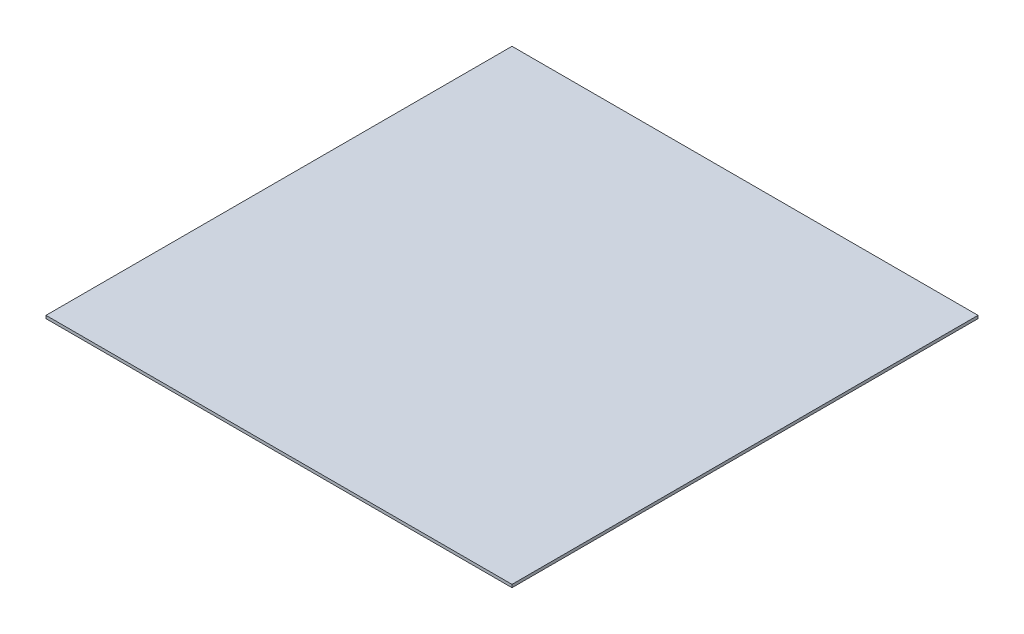
ISO-10303-21;
HEADER;
FILE_DESCRIPTION(('STEP AP214'),'2;1');
FILE_NAME('part.step','',(''),(''),'','','');
FILE_SCHEMA(('AUTOMOTIVE_DESIGN { 1 0 10303 214 1 1 1 1 }'));
ENDSEC;
DATA;
#1=APPLICATION_CONTEXT('core data for automotive mechanical design processes');
#2=APPLICATION_PROTOCOL_DEFINITION('international standard','automotive_design',2000,#1);
#3=PRODUCT_CONTEXT('',#1,'mechanical');
#4=PRODUCT('Part','Part','',(#3));
#5=PRODUCT_RELATED_PRODUCT_CATEGORY('part','',(#4));
#6=PRODUCT_DEFINITION_FORMATION('','',#4);
#7=PRODUCT_DEFINITION_CONTEXT('part definition',#1,'design');
#8=PRODUCT_DEFINITION('design','',#6,#7);
#9=PRODUCT_DEFINITION_SHAPE('','',#8);
#10=(LENGTH_UNIT() NAMED_UNIT(*) SI_UNIT(.MILLI.,.METRE.));
#11=(NAMED_UNIT(*) PLANE_ANGLE_UNIT() SI_UNIT($,.RADIAN.));
#12=(NAMED_UNIT(*) SI_UNIT($,.STERADIAN.) SOLID_ANGLE_UNIT());
#13=UNCERTAINTY_MEASURE_WITH_UNIT(LENGTH_MEASURE(1.E-05),#10,'distance_accuracy_value','');
#14=(GEOMETRIC_REPRESENTATION_CONTEXT(3) GLOBAL_UNCERTAINTY_ASSIGNED_CONTEXT((#13)) GLOBAL_UNIT_ASSIGNED_CONTEXT((#10,
#11,#12)) REPRESENTATION_CONTEXT('',''));
#15=CARTESIAN_POINT('',(0.,0.,0.));
#16=DIRECTION('',(0.,0.,1.));
#17=DIRECTION('',(1.,0.,0.));
#18=AXIS2_PLACEMENT_3D('',#15,#16,#17);
#19=CARTESIAN_POINT('',(40.,0.25,-40.));
#20=DIRECTION('',(-1.,0.,0.));
#21=DIRECTION('',(0.,0.,1.));
#22=AXIS2_PLACEMENT_3D('',#19,#20,#21);
#23=PLANE('',#22);
#24=DIRECTION('',(0.,0.,-1.));
#25=VECTOR('',#24,1.);
#26=CARTESIAN_POINT('',(40.,-0.25,-40.));
#27=LINE('',#26,#25);
#28=CARTESIAN_POINT('',(40.,-0.25,40.));
#29=VERTEX_POINT('',#28);
#30=CARTESIAN_POINT('',(40.,-0.25,-40.));
#31=VERTEX_POINT('',#30);
#32=EDGE_CURVE('E96',#29,#31,#27,.T.);
#33=ORIENTED_EDGE('',*,*,#32,.T.);
#34=DIRECTION('',(0.,-1.,0.));
#35=VECTOR('',#34,1.);
#36=CARTESIAN_POINT('',(40.,0.25,-40.));
#37=LINE('',#36,#35);
#38=CARTESIAN_POINT('',(40.,0.25,-40.));
#39=VERTEX_POINT('',#38);
#40=EDGE_CURVE('E11',#39,#31,#37,.T.);
#41=ORIENTED_EDGE('',*,*,#40,.F.);
#42=DIRECTION('',(0.,0.,-1.));
#43=VECTOR('',#42,1.);
#44=CARTESIAN_POINT('',(40.,0.25,-40.));
#45=LINE('',#44,#43);
#46=CARTESIAN_POINT('',(40.,0.25,40.));
#47=VERTEX_POINT('',#46);
#48=EDGE_CURVE('E84',#47,#39,#45,.T.);
#49=ORIENTED_EDGE('',*,*,#48,.F.);
#50=DIRECTION('',(0.,-1.,0.));
#51=VECTOR('',#50,1.);
#52=CARTESIAN_POINT('',(40.,0.25,40.));
#53=LINE('',#52,#51);
#54=EDGE_CURVE('E92',#47,#29,#53,.T.);
#55=ORIENTED_EDGE('',*,*,#54,.T.);
#56=EDGE_LOOP('',(#33,#41,#49,#55));
#57=FACE_BOUND('',#56,.T.);
#58=ADVANCED_FACE('F33',(#57),#23,.F.);
#59=CARTESIAN_POINT('',(-40.,0.25,-40.));
#60=DIRECTION('',(0.,0.,1.));
#61=DIRECTION('',(1.,0.,0.));
#62=AXIS2_PLACEMENT_3D('',#59,#60,#61);
#63=PLANE('',#62);
#64=DIRECTION('',(-1.,0.,0.));
#65=VECTOR('',#64,1.);
#66=CARTESIAN_POINT('',(-40.,-0.25,-40.));
#67=LINE('',#66,#65);
#68=CARTESIAN_POINT('',(-40.,-0.25,-40.));
#69=VERTEX_POINT('',#68);
#70=EDGE_CURVE('E88',#31,#69,#67,.T.);
#71=ORIENTED_EDGE('',*,*,#70,.T.);
#72=DIRECTION('',(0.,-1.,0.));
#73=VECTOR('',#72,1.);
#74=CARTESIAN_POINT('',(-40.,0.25,-40.));
#75=LINE('',#74,#73);
#76=CARTESIAN_POINT('',(-40.,0.25,-40.));
#77=VERTEX_POINT('',#76);
#78=EDGE_CURVE('E41',#77,#69,#75,.T.);
#79=ORIENTED_EDGE('',*,*,#78,.F.);
#80=DIRECTION('',(-1.,0.,0.));
#81=VECTOR('',#80,1.);
#82=CARTESIAN_POINT('',(-40.,0.25,-40.));
#83=LINE('',#82,#81);
#84=EDGE_CURVE('E79',#39,#77,#83,.T.);
#85=ORIENTED_EDGE('',*,*,#84,.F.);
#86=ORIENTED_EDGE('',*,*,#40,.T.);
#87=EDGE_LOOP('',(#71,#79,#85,#86));
#88=FACE_BOUND('',#87,.T.);
#89=ADVANCED_FACE('F87',(#88),#63,.F.);
#90=CARTESIAN_POINT('',(-40.,0.25,-40.));
#91=DIRECTION('',(1.,0.,0.));
#92=DIRECTION('',(0.,0.,-1.));
#93=AXIS2_PLACEMENT_3D('',#90,#91,#92);
#94=PLANE('',#93);
#95=DIRECTION('',(0.,0.,1.));
#96=VECTOR('',#95,1.);
#97=CARTESIAN_POINT('',(-40.,-0.25,-40.));
#98=LINE('',#97,#96);
#99=CARTESIAN_POINT('',(-40.,-0.25,40.));
#100=VERTEX_POINT('',#99);
#101=EDGE_CURVE('E66',#69,#100,#98,.T.);
#102=ORIENTED_EDGE('',*,*,#101,.T.);
#103=DIRECTION('',(0.,-1.,0.));
#104=VECTOR('',#103,1.);
#105=CARTESIAN_POINT('',(-40.,0.25,40.));
#106=LINE('',#105,#104);
#107=CARTESIAN_POINT('',(-40.,0.25,40.));
#108=VERTEX_POINT('',#107);
#109=EDGE_CURVE('E89',#108,#100,#106,.T.);
#110=ORIENTED_EDGE('',*,*,#109,.F.);
#111=DIRECTION('',(0.,0.,1.));
#112=VECTOR('',#111,1.);
#113=CARTESIAN_POINT('',(-40.,0.25,-40.));
#114=LINE('',#113,#112);
#115=EDGE_CURVE('E82',#77,#108,#114,.T.);
#116=ORIENTED_EDGE('',*,*,#115,.F.);
#117=ORIENTED_EDGE('',*,*,#78,.T.);
#118=EDGE_LOOP('',(#102,#110,#116,#117));
#119=FACE_BOUND('',#118,.T.);
#120=ADVANCED_FACE('F90',(#119),#94,.F.);
#121=CARTESIAN_POINT('',(-40.,0.25,40.));
#122=DIRECTION('',(0.,0.,-1.));
#123=DIRECTION('',(-1.,0.,0.));
#124=AXIS2_PLACEMENT_3D('',#121,#122,#123);
#125=PLANE('',#124);
#126=DIRECTION('',(1.,0.,0.));
#127=VECTOR('',#126,1.);
#128=CARTESIAN_POINT('',(-40.,-0.25,40.));
#129=LINE('',#128,#127);
#130=EDGE_CURVE('E72',#100,#29,#129,.T.);
#131=ORIENTED_EDGE('',*,*,#130,.T.);
#132=ORIENTED_EDGE('',*,*,#54,.F.);
#133=DIRECTION('',(1.,0.,0.));
#134=VECTOR('',#133,1.);
#135=CARTESIAN_POINT('',(-40.,0.25,40.));
#136=LINE('',#135,#134);
#137=EDGE_CURVE('E49',#108,#47,#136,.T.);
#138=ORIENTED_EDGE('',*,*,#137,.F.);
#139=ORIENTED_EDGE('',*,*,#109,.T.);
#140=EDGE_LOOP('',(#131,#132,#138,#139));
#141=FACE_BOUND('',#140,.T.);
#142=ADVANCED_FACE('F103',(#141),#125,.F.);
#143=CARTESIAN_POINT('',(0.,0.25,0.));
#144=DIRECTION('',(0.,1.,0.));
#145=DIRECTION('',(0.,0.,1.));
#146=AXIS2_PLACEMENT_3D('',#143,#144,#145);
#147=PLANE('',#146);
#148=ORIENTED_EDGE('',*,*,#48,.T.);
#149=ORIENTED_EDGE('',*,*,#84,.T.);
#150=ORIENTED_EDGE('',*,*,#115,.T.);
#151=ORIENTED_EDGE('',*,*,#137,.T.);
#152=EDGE_LOOP('',(#148,#149,#150,#151));
#153=FACE_BOUND('',#152,.T.);
#154=ADVANCED_FACE('F80',(#153),#147,.T.);
#155=CARTESIAN_POINT('',(0.,-0.25,0.));
#156=DIRECTION('',(0.,1.,0.));
#157=DIRECTION('',(0.,0.,1.));
#158=AXIS2_PLACEMENT_3D('',#155,#156,#157);
#159=PLANE('',#158);
#160=ORIENTED_EDGE('',*,*,#32,.F.);
#161=ORIENTED_EDGE('',*,*,#130,.F.);
#162=ORIENTED_EDGE('',*,*,#101,.F.);
#163=ORIENTED_EDGE('',*,*,#70,.F.);
#164=EDGE_LOOP('',(#160,#161,#162,#163));
#165=FACE_BOUND('',#164,.T.);
#166=ADVANCED_FACE('F106',(#165),#159,.F.);
#167=CLOSED_SHELL('',(#58,#89,#120,#142,#154,#166));
#168=MANIFOLD_SOLID_BREP('B2',#167);
#169=ADVANCED_BREP_SHAPE_REPRESENTATION('',(#18,#168),#14);
#170=SHAPE_DEFINITION_REPRESENTATION(#9,#169);
ENDSEC;
END-ISO-10303-21;
